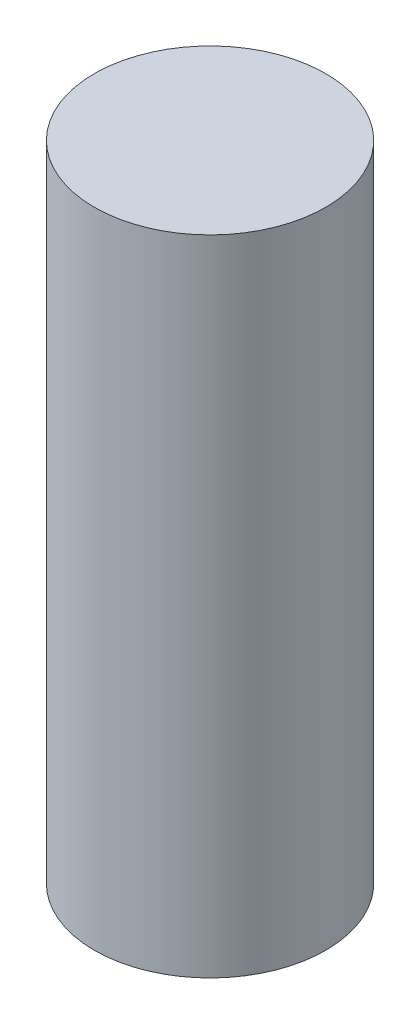
ISO-10303-21;
HEADER;
FILE_DESCRIPTION(('STEP AP214'),'2;1');
FILE_NAME('part.step','',(''),(''),'','','');
FILE_SCHEMA(('AUTOMOTIVE_DESIGN { 1 0 10303 214 1 1 1 1 }'));
ENDSEC;
DATA;
#1=APPLICATION_CONTEXT('core data for automotive mechanical design processes');
#2=APPLICATION_PROTOCOL_DEFINITION('international standard','automotive_design',2000,#1);
#3=PRODUCT_CONTEXT('',#1,'mechanical');
#4=PRODUCT('Part','Part','',(#3));
#5=PRODUCT_RELATED_PRODUCT_CATEGORY('part','',(#4));
#6=PRODUCT_DEFINITION_FORMATION('','',#4);
#7=PRODUCT_DEFINITION_CONTEXT('part definition',#1,'design');
#8=PRODUCT_DEFINITION('design','',#6,#7);
#9=PRODUCT_DEFINITION_SHAPE('','',#8);
#10=(LENGTH_UNIT() NAMED_UNIT(*) SI_UNIT(.MILLI.,.METRE.));
#11=(NAMED_UNIT(*) PLANE_ANGLE_UNIT() SI_UNIT($,.RADIAN.));
#12=(NAMED_UNIT(*) SI_UNIT($,.STERADIAN.) SOLID_ANGLE_UNIT());
#13=UNCERTAINTY_MEASURE_WITH_UNIT(LENGTH_MEASURE(1.E-05),#10,'distance_accuracy_value','');
#14=(GEOMETRIC_REPRESENTATION_CONTEXT(3) GLOBAL_UNCERTAINTY_ASSIGNED_CONTEXT((#13)) GLOBAL_UNIT_ASSIGNED_CONTEXT((#10,
#11,#12)) REPRESENTATION_CONTEXT('',''));
#15=CARTESIAN_POINT('',(0.,0.,0.));
#16=DIRECTION('',(0.,0.,1.));
#17=DIRECTION('',(1.,0.,0.));
#18=AXIS2_PLACEMENT_3D('',#15,#16,#17);
#19=CARTESIAN_POINT('',(0.,22.239986,0.));
#20=DIRECTION('',(0.,-1.,0.));
#21=DIRECTION('',(0.,0.,-1.));
#22=AXIS2_PLACEMENT_3D('',#19,#20,#21);
#23=CYLINDRICAL_SURFACE('',#22,4.);
#24=CARTESIAN_POINT('',(0.,22.239986,0.));
#25=DIRECTION('',(0.,1.,0.));
#26=DIRECTION('',(0.,0.,1.));
#27=AXIS2_PLACEMENT_3D('',#24,#25,#26);
#28=CIRCLE('',#27,4.);
#29=CARTESIAN_POINT('',(0.,22.239986,4.));
#30=VERTEX_POINT('',#29);
#31=EDGE_CURVE('E10',#30,#30,#28,.T.);
#32=ORIENTED_EDGE('',*,*,#31,.F.);
#33=EDGE_LOOP('',(#32));
#34=FACE_BOUND('',#33,.T.);
#35=CARTESIAN_POINT('',(0.,0.,0.));
#36=DIRECTION('',(0.,1.,0.));
#37=DIRECTION('',(0.,0.,1.));
#38=AXIS2_PLACEMENT_3D('',#35,#36,#37);
#39=CIRCLE('',#38,4.);
#40=CARTESIAN_POINT('',(0.,0.,4.));
#41=VERTEX_POINT('',#40);
#42=EDGE_CURVE('E40',#41,#41,#39,.T.);
#43=ORIENTED_EDGE('',*,*,#42,.T.);
#44=EDGE_LOOP('',(#43));
#45=FACE_BOUND('',#44,.T.);
#46=ADVANCED_FACE('F37',(#34,#45),#23,.T.);
#47=CARTESIAN_POINT('',(0.,22.239986,0.));
#48=DIRECTION('',(0.,1.,0.));
#49=DIRECTION('',(0.,0.,1.));
#50=AXIS2_PLACEMENT_3D('',#47,#48,#49);
#51=PLANE('',#50);
#52=ORIENTED_EDGE('',*,*,#31,.T.);
#53=EDGE_LOOP('',(#52));
#54=FACE_BOUND('',#53,.T.);
#55=ADVANCED_FACE('F52',(#54),#51,.T.);
#56=CARTESIAN_POINT('',(0.,0.,0.));
#57=DIRECTION('',(0.,1.,0.));
#58=DIRECTION('',(0.,0.,1.));
#59=AXIS2_PLACEMENT_3D('',#56,#57,#58);
#60=PLANE('',#59);
#61=ORIENTED_EDGE('',*,*,#42,.F.);
#62=EDGE_LOOP('',(#61));
#63=FACE_BOUND('',#62,.T.);
#64=ADVANCED_FACE('F50',(#63),#60,.F.);
#65=CLOSED_SHELL('',(#46,#55,#64));
#66=MANIFOLD_SOLID_BREP('B2',#65);
#67=ADVANCED_BREP_SHAPE_REPRESENTATION('',(#18,#66),#14);
#68=SHAPE_DEFINITION_REPRESENTATION(#9,#67);
ENDSEC;
END-ISO-10303-21;
